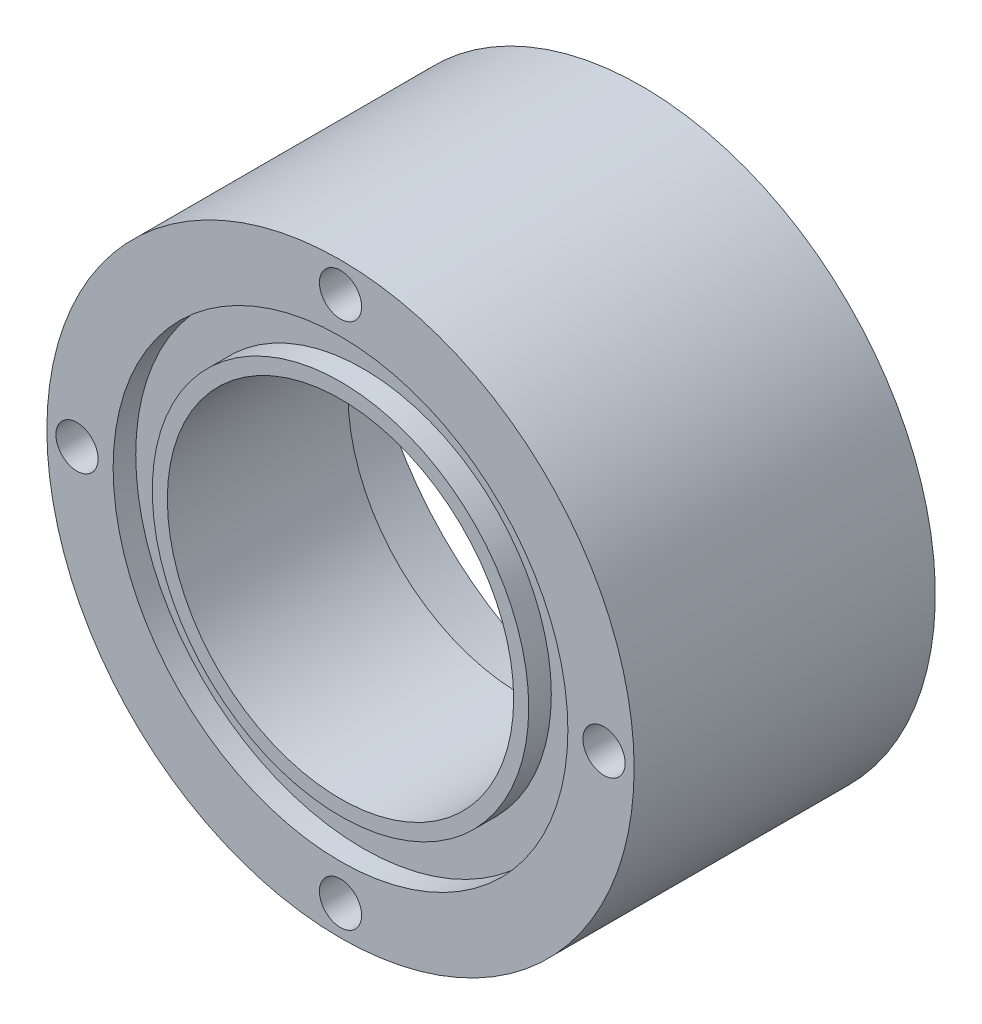
ISO-10303-21;
HEADER;
FILE_DESCRIPTION(('STEP AP214'),'2;1');
FILE_NAME('part.step','',(''),(''),'','','');
FILE_SCHEMA(('AUTOMOTIVE_DESIGN { 1 0 10303 214 1 1 1 1 }'));
ENDSEC;
DATA;
#1=APPLICATION_CONTEXT('core data for automotive mechanical design processes');
#2=APPLICATION_PROTOCOL_DEFINITION('international standard','automotive_design',2000,#1);
#3=PRODUCT_CONTEXT('',#1,'mechanical');
#4=PRODUCT('Part','Part','',(#3));
#5=PRODUCT_RELATED_PRODUCT_CATEGORY('part','',(#4));
#6=PRODUCT_DEFINITION_FORMATION('','',#4);
#7=PRODUCT_DEFINITION_CONTEXT('part definition',#1,'design');
#8=PRODUCT_DEFINITION('design','',#6,#7);
#9=PRODUCT_DEFINITION_SHAPE('','',#8);
#10=(LENGTH_UNIT() NAMED_UNIT(*) SI_UNIT(.MILLI.,.METRE.));
#11=(NAMED_UNIT(*) PLANE_ANGLE_UNIT() SI_UNIT($,.RADIAN.));
#12=(NAMED_UNIT(*) SI_UNIT($,.STERADIAN.) SOLID_ANGLE_UNIT());
#13=UNCERTAINTY_MEASURE_WITH_UNIT(LENGTH_MEASURE(1.E-05),#10,'distance_accuracy_value','');
#14=(GEOMETRIC_REPRESENTATION_CONTEXT(3) GLOBAL_UNCERTAINTY_ASSIGNED_CONTEXT((#13)) GLOBAL_UNIT_ASSIGNED_CONTEXT((#10,
#11,#12)) REPRESENTATION_CONTEXT('',''));
#15=CARTESIAN_POINT('',(0.,0.,0.));
#16=DIRECTION('',(0.,0.,1.));
#17=DIRECTION('',(1.,0.,0.));
#18=AXIS2_PLACEMENT_3D('',#15,#16,#17);
#19=CARTESIAN_POINT('',(0.,0.,0.));
#20=DIRECTION('',(0.,0.,1.));
#21=DIRECTION('',(1.,0.,0.));
#22=AXIS2_PLACEMENT_3D('',#19,#20,#21);
#23=PLANE('',#22);
#24=CARTESIAN_POINT('',(-17.,0.,0.));
#25=DIRECTION('',(0.,0.,-1.));
#26=DIRECTION('',(-1.,0.,0.));
#27=AXIS2_PLACEMENT_3D('',#24,#25,#26);
#28=CIRCLE('',#27,1.4);
#29=CARTESIAN_POINT('',(-18.4,0.,0.));
#30=VERTEX_POINT('',#29);
#31=EDGE_CURVE('E127',#30,#30,#28,.T.);
#32=ORIENTED_EDGE('',*,*,#31,.F.);
#33=EDGE_LOOP('',(#32));
#34=FACE_BOUND('',#33,.T.);
#35=CARTESIAN_POINT('',(0.,17.,0.));
#36=DIRECTION('',(0.,0.,-1.));
#37=DIRECTION('',(-1.,0.,0.));
#38=AXIS2_PLACEMENT_3D('',#35,#36,#37);
#39=CIRCLE('',#38,1.4);
#40=CARTESIAN_POINT('',(-1.4,17.,0.));
#41=VERTEX_POINT('',#40);
#42=EDGE_CURVE('E126',#41,#41,#39,.T.);
#43=ORIENTED_EDGE('',*,*,#42,.F.);
#44=EDGE_LOOP('',(#43));
#45=FACE_BOUND('',#44,.T.);
#46=CARTESIAN_POINT('',(17.,0.,0.));
#47=DIRECTION('',(0.,0.,-1.));
#48=DIRECTION('',(-1.,0.,0.));
#49=AXIS2_PLACEMENT_3D('',#46,#47,#48);
#50=CIRCLE('',#49,1.4);
#51=CARTESIAN_POINT('',(15.6,0.,0.));
#52=VERTEX_POINT('',#51);
#53=EDGE_CURVE('E276',#52,#52,#50,.T.);
#54=ORIENTED_EDGE('',*,*,#53,.F.);
#55=EDGE_LOOP('',(#54));
#56=FACE_BOUND('',#55,.T.);
#57=CARTESIAN_POINT('',(0.,-17.,0.));
#58=DIRECTION('',(0.,0.,-1.));
#59=DIRECTION('',(-1.,0.,0.));
#60=AXIS2_PLACEMENT_3D('',#57,#58,#59);
#61=CIRCLE('',#60,1.4);
#62=CARTESIAN_POINT('',(-1.4,-17.,0.));
#63=VERTEX_POINT('',#62);
#64=EDGE_CURVE('E270',#63,#63,#61,.T.);
#65=ORIENTED_EDGE('',*,*,#64,.F.);
#66=EDGE_LOOP('',(#65));
#67=FACE_BOUND('',#66,.T.);
#68=CARTESIAN_POINT('',(0.,0.,0.));
#69=DIRECTION('',(0.,0.,-1.));
#70=DIRECTION('',(-1.,0.,0.));
#71=AXIS2_PLACEMENT_3D('',#68,#69,#70);
#72=CIRCLE('',#71,15.1);
#73=CARTESIAN_POINT('',(-15.1,0.,0.));
#74=VERTEX_POINT('',#73);
#75=EDGE_CURVE('E257',#74,#74,#72,.T.);
#76=ORIENTED_EDGE('',*,*,#75,.F.);
#77=EDGE_LOOP('',(#76));
#78=FACE_BOUND('',#77,.T.);
#79=CARTESIAN_POINT('',(0.,0.,0.));
#80=DIRECTION('',(0.,0.,-1.));
#81=DIRECTION('',(-1.,0.,0.));
#82=AXIS2_PLACEMENT_3D('',#79,#80,#81);
#83=CIRCLE('',#82,18.5);
#84=CARTESIAN_POINT('',(-18.5,0.,0.));
#85=VERTEX_POINT('',#84);
#86=EDGE_CURVE('E366',#85,#85,#83,.T.);
#87=ORIENTED_EDGE('',*,*,#86,.T.);
#88=EDGE_LOOP('',(#87));
#89=FACE_BOUND('',#88,.T.);
#90=ADVANCED_FACE('F45',(#34,#45,#56,#67,#78,#89),#23,.F.);
#91=CARTESIAN_POINT('',(0.,0.,0.));
#92=DIRECTION('',(0.,0.,1.));
#93=DIRECTION('',(1.,0.,0.));
#94=AXIS2_PLACEMENT_3D('',#91,#92,#93);
#95=CIRCLE('',#94,11.5);
#96=CARTESIAN_POINT('',(11.5,0.,0.));
#97=VERTEX_POINT('',#96);
#98=EDGE_CURVE('E185',#97,#97,#95,.T.);
#99=ORIENTED_EDGE('',*,*,#98,.T.);
#100=EDGE_LOOP('',(#99));
#101=FACE_BOUND('',#100,.T.);
#102=CARTESIAN_POINT('',(0.,0.,0.));
#103=DIRECTION('',(0.,0.,-1.));
#104=DIRECTION('',(-1.,0.,0.));
#105=AXIS2_PLACEMENT_3D('',#102,#103,#104);
#106=CIRCLE('',#105,12.5);
#107=CARTESIAN_POINT('',(-12.5,0.,0.));
#108=VERTEX_POINT('',#107);
#109=EDGE_CURVE('E251',#108,#108,#106,.T.);
#110=ORIENTED_EDGE('',*,*,#109,.T.);
#111=EDGE_LOOP('',(#110));
#112=FACE_BOUND('',#111,.T.);
#113=ADVANCED_FACE('F225',(#101,#112),#23,.F.);
#114=CARTESIAN_POINT('',(0.,0.,12.));
#115=DIRECTION('',(0.,0.,1.));
#116=DIRECTION('',(1.,0.,0.));
#117=AXIS2_PLACEMENT_3D('',#114,#115,#116);
#118=PLANE('',#117);
#119=CARTESIAN_POINT('',(0.,0.,12.));
#120=DIRECTION('',(0.,0.,1.));
#121=DIRECTION('',(1.,0.,0.));
#122=AXIS2_PLACEMENT_3D('',#119,#120,#121);
#123=CIRCLE('',#122,11.5);
#124=CARTESIAN_POINT('',(11.5,0.,12.));
#125=VERTEX_POINT('',#124);
#126=EDGE_CURVE('E188',#125,#125,#123,.T.);
#127=ORIENTED_EDGE('',*,*,#126,.F.);
#128=EDGE_LOOP('',(#127));
#129=FACE_BOUND('',#128,.T.);
#130=CARTESIAN_POINT('',(0.,0.,12.));
#131=DIRECTION('',(0.,0.,1.));
#132=DIRECTION('',(1.,0.,0.));
#133=AXIS2_PLACEMENT_3D('',#130,#131,#132);
#134=CIRCLE('',#133,12.5);
#135=CARTESIAN_POINT('',(12.5,0.,12.));
#136=VERTEX_POINT('',#135);
#137=EDGE_CURVE('E153',#136,#136,#134,.T.);
#138=ORIENTED_EDGE('',*,*,#137,.T.);
#139=EDGE_LOOP('',(#138));
#140=FACE_BOUND('',#139,.T.);
#141=ADVANCED_FACE('F230',(#129,#140),#118,.T.);
#142=CARTESIAN_POINT('',(0.,0.,12.));
#143=DIRECTION('',(0.,0.,1.));
#144=DIRECTION('',(1.,0.,0.));
#145=AXIS2_PLACEMENT_3D('',#142,#143,#144);
#146=CIRCLE('',#145,15.1);
#147=CARTESIAN_POINT('',(15.1,0.,12.));
#148=VERTEX_POINT('',#147);
#149=EDGE_CURVE('E157',#148,#148,#146,.T.);
#150=ORIENTED_EDGE('',*,*,#149,.F.);
#151=EDGE_LOOP('',(#150));
#152=FACE_BOUND('',#151,.T.);
#153=CARTESIAN_POINT('',(-17.5,0.,12.));
#154=DIRECTION('',(0.,0.,1.));
#155=DIRECTION('',(0.,1.,0.));
#156=AXIS2_PLACEMENT_3D('',#153,#154,#155);
#157=CIRCLE('',#156,1.4);
#158=CARTESIAN_POINT('',(-17.5,1.39999999999994,12.));
#159=VERTEX_POINT('',#158);
#160=EDGE_CURVE('E168',#159,#159,#157,.T.);
#161=ORIENTED_EDGE('',*,*,#160,.F.);
#162=EDGE_LOOP('',(#161));
#163=FACE_BOUND('',#162,.T.);
#164=CARTESIAN_POINT('',(0.,-17.5,12.));
#165=DIRECTION('',(0.,0.,1.));
#166=DIRECTION('',(-1.,0.,0.));
#167=AXIS2_PLACEMENT_3D('',#164,#165,#166);
#168=CIRCLE('',#167,1.4);
#169=CARTESIAN_POINT('',(-1.4,-17.5,12.));
#170=VERTEX_POINT('',#169);
#171=EDGE_CURVE('E174',#170,#170,#168,.T.);
#172=ORIENTED_EDGE('',*,*,#171,.F.);
#173=EDGE_LOOP('',(#172));
#174=FACE_BOUND('',#173,.T.);
#175=CARTESIAN_POINT('',(17.5,1.83302770289265E-13,12.));
#176=DIRECTION('',(0.,0.,1.));
#177=DIRECTION('',(0.,-1.,0.));
#178=AXIS2_PLACEMENT_3D('',#175,#176,#177);
#179=CIRCLE('',#178,1.4);
#180=CARTESIAN_POINT('',(17.5,-1.39999999999982,12.));
#181=VERTEX_POINT('',#180);
#182=EDGE_CURVE('E163',#181,#181,#179,.T.);
#183=ORIENTED_EDGE('',*,*,#182,.F.);
#184=EDGE_LOOP('',(#183));
#185=FACE_BOUND('',#184,.T.);
#186=CARTESIAN_POINT('',(0.,17.5,12.));
#187=DIRECTION('',(0.,0.,1.));
#188=DIRECTION('',(1.,0.,0.));
#189=AXIS2_PLACEMENT_3D('',#186,#187,#188);
#190=CIRCLE('',#189,1.4);
#191=CARTESIAN_POINT('',(1.4,17.5,12.));
#192=VERTEX_POINT('',#191);
#193=EDGE_CURVE('E167',#192,#192,#190,.T.);
#194=ORIENTED_EDGE('',*,*,#193,.F.);
#195=EDGE_LOOP('',(#194));
#196=FACE_BOUND('',#195,.T.);
#197=CARTESIAN_POINT('',(0.,0.,12.));
#198=DIRECTION('',(0.,0.,1.));
#199=DIRECTION('',(1.,0.,0.));
#200=AXIS2_PLACEMENT_3D('',#197,#198,#199);
#201=CIRCLE('',#200,19.5);
#202=CARTESIAN_POINT('',(19.5,0.,12.));
#203=VERTEX_POINT('',#202);
#204=EDGE_CURVE('E191',#203,#203,#201,.T.);
#205=ORIENTED_EDGE('',*,*,#204,.T.);
#206=EDGE_LOOP('',(#205));
#207=FACE_BOUND('',#206,.T.);
#208=ADVANCED_FACE('F235',(#152,#163,#174,#185,#196,#207),#118,.T.);
#209=CARTESIAN_POINT('',(0.,0.,12.));
#210=DIRECTION('',(0.,0.,-1.));
#211=DIRECTION('',(-1.,0.,0.));
#212=AXIS2_PLACEMENT_3D('',#209,#210,#211);
#213=CYLINDRICAL_SURFACE('',#212,19.5);
#214=ORIENTED_EDGE('',*,*,#204,.F.);
#215=EDGE_LOOP('',(#214));
#216=FACE_BOUND('',#215,.T.);
#217=CARTESIAN_POINT('',(0.,0.,-8.));
#218=DIRECTION('',(0.,0.,-1.));
#219=DIRECTION('',(-1.,0.,0.));
#220=AXIS2_PLACEMENT_3D('',#217,#218,#219);
#221=CIRCLE('',#220,19.5);
#222=CARTESIAN_POINT('',(-19.5,0.,-8.));
#223=VERTEX_POINT('',#222);
#224=EDGE_CURVE('E254',#223,#223,#221,.T.);
#225=ORIENTED_EDGE('',*,*,#224,.F.);
#226=EDGE_LOOP('',(#225));
#227=FACE_BOUND('',#226,.T.);
#228=ADVANCED_FACE('F47',(#216,#227),#213,.T.);
#229=CARTESIAN_POINT('',(0.,0.,12.));
#230=DIRECTION('',(0.,0.,-1.));
#231=DIRECTION('',(-1.,0.,0.));
#232=AXIS2_PLACEMENT_3D('',#229,#230,#231);
#233=CYLINDRICAL_SURFACE('',#232,11.5);
#234=ORIENTED_EDGE('',*,*,#126,.T.);
#235=EDGE_LOOP('',(#234));
#236=FACE_BOUND('',#235,.T.);
#237=ORIENTED_EDGE('',*,*,#98,.F.);
#238=EDGE_LOOP('',(#237));
#239=FACE_BOUND('',#238,.T.);
#240=ADVANCED_FACE('F222',(#236,#239),#233,.F.);
#241=CARTESIAN_POINT('',(0.,17.5,5.));
#242=DIRECTION('',(0.,0.,1.));
#243=DIRECTION('',(1.,0.,0.));
#244=AXIS2_PLACEMENT_3D('',#241,#242,#243);
#245=CYLINDRICAL_SURFACE('',#244,1.4);
#246=CARTESIAN_POINT('',(0.,17.5,5.));
#247=DIRECTION('',(0.,0.,1.));
#248=DIRECTION('',(1.,0.,0.));
#249=AXIS2_PLACEMENT_3D('',#246,#247,#248);
#250=CIRCLE('',#249,1.4);
#251=CARTESIAN_POINT('',(1.37749773139559,17.25,5.));
#252=VERTEX_POINT('',#251);
#253=CARTESIAN_POINT('',(-1.37749773139559,17.25,5.));
#254=VERTEX_POINT('',#253);
#255=EDGE_CURVE('E182',#252,#254,#250,.T.);
#256=ORIENTED_EDGE('',*,*,#255,.F.);
#257=DIRECTION('',(0.,0.,-1.));
#258=VECTOR('',#257,1.);
#259=CARTESIAN_POINT('',(1.37749773139559,17.25,3.5));
#260=LINE('',#259,#258);
#261=CARTESIAN_POINT('',(1.37749773139559,17.25,7.));
#262=VERTEX_POINT('',#261);
#263=EDGE_CURVE('E60',#252,#262,#260,.F.);
#264=ORIENTED_EDGE('',*,*,#263,.T.);
#265=CARTESIAN_POINT('',(0.,17.5,7.));
#266=DIRECTION('',(0.,0.,-1.));
#267=DIRECTION('',(-1.,0.,0.));
#268=AXIS2_PLACEMENT_3D('',#265,#266,#267);
#269=CIRCLE('',#268,1.4);
#270=CARTESIAN_POINT('',(-1.37749773139559,17.25,7.));
#271=VERTEX_POINT('',#270);
#272=EDGE_CURVE('E12',#271,#262,#269,.F.);
#273=ORIENTED_EDGE('',*,*,#272,.F.);
#274=DIRECTION('',(0.,0.,-1.));
#275=VECTOR('',#274,1.);
#276=CARTESIAN_POINT('',(-1.37749773139559,17.25,3.5));
#277=LINE('',#276,#275);
#278=EDGE_CURVE('E149',#271,#254,#277,.T.);
#279=ORIENTED_EDGE('',*,*,#278,.T.);
#280=EDGE_LOOP('',(#256,#264,#273,#279));
#281=FACE_BOUND('',#280,.T.);
#282=ORIENTED_EDGE('',*,*,#193,.T.);
#283=EDGE_LOOP('',(#282));
#284=FACE_BOUND('',#283,.T.);
#285=ADVANCED_FACE('F209',(#281,#284),#245,.F.);
#286=CARTESIAN_POINT('',(0.,0.,5.));
#287=DIRECTION('',(0.,0.,1.));
#288=DIRECTION('',(1.,0.,0.));
#289=AXIS2_PLACEMENT_3D('',#286,#287,#288);
#290=PLANE('',#289);
#291=CARTESIAN_POINT('',(0.,17.,5.));
#292=DIRECTION('',(0.,0.,1.));
#293=DIRECTION('',(1.,0.,0.));
#294=AXIS2_PLACEMENT_3D('',#291,#292,#293);
#295=CIRCLE('',#294,1.4);
#296=EDGE_CURVE('E53',#252,#254,#295,.T.);
#297=ORIENTED_EDGE('',*,*,#296,.F.);
#298=ORIENTED_EDGE('',*,*,#255,.T.);
#299=EDGE_LOOP('',(#297,#298));
#300=FACE_BOUND('',#299,.T.);
#301=ADVANCED_FACE('F211',(#300),#290,.T.);
#302=CARTESIAN_POINT('',(17.5,1.83302770289265E-13,5.));
#303=DIRECTION('',(0.,0.,1.));
#304=DIRECTION('',(1.,0.,0.));
#305=AXIS2_PLACEMENT_3D('',#302,#303,#304);
#306=CYLINDRICAL_SURFACE('',#305,1.4);
#307=CARTESIAN_POINT('',(17.5,1.83302770289265E-13,5.));
#308=DIRECTION('',(0.,0.,1.));
#309=DIRECTION('',(0.,-1.,0.));
#310=AXIS2_PLACEMENT_3D('',#307,#308,#309);
#311=CIRCLE('',#310,1.4);
#312=CARTESIAN_POINT('',(17.2500000000005,-1.3774977313955,5.));
#313=VERTEX_POINT('',#312);
#314=CARTESIAN_POINT('',(17.2499999999995,1.37749773139568,5.));
#315=VERTEX_POINT('',#314);
#316=EDGE_CURVE('E177',#313,#315,#311,.T.);
#317=ORIENTED_EDGE('',*,*,#316,.F.);
#318=DIRECTION('',(0.,0.,-1.));
#319=VECTOR('',#318,1.);
#320=CARTESIAN_POINT('',(17.2500000000005,-1.3774977313955,3.5));
#321=LINE('',#320,#319);
#322=CARTESIAN_POINT('',(17.2500000000005,-1.3774977313955,7.));
#323=VERTEX_POINT('',#322);
#324=EDGE_CURVE('E68',#313,#323,#321,.F.);
#325=ORIENTED_EDGE('',*,*,#324,.T.);
#326=CARTESIAN_POINT('',(17.5,1.83302770289265E-13,7.));
#327=DIRECTION('',(0.,0.,-1.));
#328=DIRECTION('',(-1.,0.,0.));
#329=AXIS2_PLACEMENT_3D('',#326,#327,#328);
#330=CIRCLE('',#329,1.4);
#331=CARTESIAN_POINT('',(17.2499999999995,1.37749773139568,7.));
#332=VERTEX_POINT('',#331);
#333=EDGE_CURVE('E202',#332,#323,#330,.F.);
#334=ORIENTED_EDGE('',*,*,#333,.F.);
#335=DIRECTION('',(0.,0.,-1.));
#336=VECTOR('',#335,1.);
#337=CARTESIAN_POINT('',(17.2499999999995,1.37749773139568,3.5));
#338=LINE('',#337,#336);
#339=EDGE_CURVE('E145',#332,#315,#338,.T.);
#340=ORIENTED_EDGE('',*,*,#339,.T.);
#341=EDGE_LOOP('',(#317,#325,#334,#340));
#342=FACE_BOUND('',#341,.T.);
#343=ORIENTED_EDGE('',*,*,#182,.T.);
#344=EDGE_LOOP('',(#343));
#345=FACE_BOUND('',#344,.T.);
#346=ADVANCED_FACE('F213',(#342,#345),#306,.F.);
#347=CARTESIAN_POINT('',(0.,0.,5.));
#348=DIRECTION('',(0.,0.,1.));
#349=DIRECTION('',(0.,-1.,0.));
#350=AXIS2_PLACEMENT_3D('',#347,#348,#349);
#351=PLANE('',#350);
#352=CARTESIAN_POINT('',(17.,0.,5.));
#353=DIRECTION('',(0.,0.,1.));
#354=DIRECTION('',(1.,0.,0.));
#355=AXIS2_PLACEMENT_3D('',#352,#353,#354);
#356=CIRCLE('',#355,1.4);
#357=EDGE_CURVE('E200',#313,#315,#356,.T.);
#358=ORIENTED_EDGE('',*,*,#357,.F.);
#359=ORIENTED_EDGE('',*,*,#316,.T.);
#360=EDGE_LOOP('',(#358,#359));
#361=FACE_BOUND('',#360,.T.);
#362=ADVANCED_FACE('F219',(#361),#351,.T.);
#363=CARTESIAN_POINT('',(0.,-17.5,5.));
#364=DIRECTION('',(0.,0.,1.));
#365=DIRECTION('',(1.,0.,0.));
#366=AXIS2_PLACEMENT_3D('',#363,#364,#365);
#367=CYLINDRICAL_SURFACE('',#366,1.4);
#368=CARTESIAN_POINT('',(0.,-17.5,5.));
#369=DIRECTION('',(0.,0.,1.));
#370=DIRECTION('',(-1.,0.,0.));
#371=AXIS2_PLACEMENT_3D('',#368,#369,#370);
#372=CIRCLE('',#371,1.4);
#373=CARTESIAN_POINT('',(-1.37749773139559,-17.25,5.));
#374=VERTEX_POINT('',#373);
#375=CARTESIAN_POINT('',(1.37749773139559,-17.25,5.));
#376=VERTEX_POINT('',#375);
#377=EDGE_CURVE('E171',#374,#376,#372,.T.);
#378=ORIENTED_EDGE('',*,*,#377,.F.);
#379=DIRECTION('',(0.,0.,-1.));
#380=VECTOR('',#379,1.);
#381=CARTESIAN_POINT('',(-1.37749773139559,-17.25,3.5));
#382=LINE('',#381,#380);
#383=CARTESIAN_POINT('',(-1.37749773139559,-17.25,7.));
#384=VERTEX_POINT('',#383);
#385=EDGE_CURVE('E137',#374,#384,#382,.F.);
#386=ORIENTED_EDGE('',*,*,#385,.T.);
#387=CARTESIAN_POINT('',(0.,-17.5,7.));
#388=DIRECTION('',(0.,0.,-1.));
#389=DIRECTION('',(-1.,0.,0.));
#390=AXIS2_PLACEMENT_3D('',#387,#388,#389);
#391=CIRCLE('',#390,1.4);
#392=CARTESIAN_POINT('',(1.37749773139559,-17.25,7.));
#393=VERTEX_POINT('',#392);
#394=EDGE_CURVE('E198',#393,#384,#391,.F.);
#395=ORIENTED_EDGE('',*,*,#394,.F.);
#396=DIRECTION('',(0.,0.,-1.));
#397=VECTOR('',#396,1.);
#398=CARTESIAN_POINT('',(1.37749773139559,-17.25,3.5));
#399=LINE('',#398,#397);
#400=EDGE_CURVE('E134',#393,#376,#399,.T.);
#401=ORIENTED_EDGE('',*,*,#400,.T.);
#402=EDGE_LOOP('',(#378,#386,#395,#401));
#403=FACE_BOUND('',#402,.T.);
#404=ORIENTED_EDGE('',*,*,#171,.T.);
#405=EDGE_LOOP('',(#404));
#406=FACE_BOUND('',#405,.T.);
#407=ADVANCED_FACE('F318',(#403,#406),#367,.F.);
#408=CARTESIAN_POINT('',(0.,0.,5.));
#409=DIRECTION('',(0.,0.,1.));
#410=DIRECTION('',(-1.,0.,0.));
#411=AXIS2_PLACEMENT_3D('',#408,#409,#410);
#412=PLANE('',#411);
#413=CARTESIAN_POINT('',(0.,-17.,5.));
#414=DIRECTION('',(0.,0.,1.));
#415=DIRECTION('',(1.,0.,0.));
#416=AXIS2_PLACEMENT_3D('',#413,#414,#415);
#417=CIRCLE('',#416,1.4);
#418=EDGE_CURVE('E118',#374,#376,#417,.T.);
#419=ORIENTED_EDGE('',*,*,#418,.F.);
#420=ORIENTED_EDGE('',*,*,#377,.T.);
#421=EDGE_LOOP('',(#419,#420));
#422=FACE_BOUND('',#421,.T.);
#423=ADVANCED_FACE('F315',(#422),#412,.T.);
#424=CARTESIAN_POINT('',(-17.5,0.,5.));
#425=DIRECTION('',(0.,0.,1.));
#426=DIRECTION('',(1.,0.,0.));
#427=AXIS2_PLACEMENT_3D('',#424,#425,#426);
#428=CYLINDRICAL_SURFACE('',#427,1.4);
#429=CARTESIAN_POINT('',(-17.5,0.,5.));
#430=DIRECTION('',(0.,0.,1.));
#431=DIRECTION('',(0.,1.,0.));
#432=AXIS2_PLACEMENT_3D('',#429,#430,#431);
#433=CIRCLE('',#432,1.4);
#434=CARTESIAN_POINT('',(-17.2500000000002,1.37749773139556,5.));
#435=VERTEX_POINT('',#434);
#436=CARTESIAN_POINT('',(-17.2499999999998,-1.37749773139562,5.));
#437=VERTEX_POINT('',#436);
#438=EDGE_CURVE('E133',#435,#437,#433,.T.);
#439=ORIENTED_EDGE('',*,*,#438,.F.);
#440=DIRECTION('',(0.,0.,-1.));
#441=VECTOR('',#440,1.);
#442=CARTESIAN_POINT('',(-17.2500000000002,1.37749773139556,3.5));
#443=LINE('',#442,#441);
#444=CARTESIAN_POINT('',(-17.2500000000002,1.37749773139556,7.));
#445=VERTEX_POINT('',#444);
#446=EDGE_CURVE('E123',#435,#445,#443,.F.);
#447=ORIENTED_EDGE('',*,*,#446,.T.);
#448=CARTESIAN_POINT('',(-17.5,0.,7.));
#449=DIRECTION('',(0.,0.,-1.));
#450=DIRECTION('',(-1.,0.,0.));
#451=AXIS2_PLACEMENT_3D('',#448,#449,#450);
#452=CIRCLE('',#451,1.4);
#453=CARTESIAN_POINT('',(-17.2499999999998,-1.37749773139562,7.));
#454=VERTEX_POINT('',#453);
#455=EDGE_CURVE('E111',#454,#445,#452,.F.);
#456=ORIENTED_EDGE('',*,*,#455,.F.);
#457=DIRECTION('',(0.,0.,-1.));
#458=VECTOR('',#457,1.);
#459=CARTESIAN_POINT('',(-17.2499999999998,-1.37749773139562,3.5));
#460=LINE('',#459,#458);
#461=EDGE_CURVE('E125',#454,#437,#460,.T.);
#462=ORIENTED_EDGE('',*,*,#461,.T.);
#463=EDGE_LOOP('',(#439,#447,#456,#462));
#464=FACE_BOUND('',#463,.T.);
#465=ORIENTED_EDGE('',*,*,#160,.T.);
#466=EDGE_LOOP('',(#465));
#467=FACE_BOUND('',#466,.T.);
#468=ADVANCED_FACE('F130',(#464,#467),#428,.F.);
#469=CARTESIAN_POINT('',(0.,0.,5.));
#470=DIRECTION('',(0.,0.,1.));
#471=DIRECTION('',(0.,1.,0.));
#472=AXIS2_PLACEMENT_3D('',#469,#470,#471);
#473=PLANE('',#472);
#474=CARTESIAN_POINT('',(-17.,0.,5.));
#475=DIRECTION('',(0.,0.,1.));
#476=DIRECTION('',(1.,0.,0.));
#477=AXIS2_PLACEMENT_3D('',#474,#475,#476);
#478=CIRCLE('',#477,1.4);
#479=EDGE_CURVE('E119',#435,#437,#478,.T.);
#480=ORIENTED_EDGE('',*,*,#479,.F.);
#481=ORIENTED_EDGE('',*,*,#438,.T.);
#482=EDGE_LOOP('',(#480,#481));
#483=FACE_BOUND('',#482,.T.);
#484=ADVANCED_FACE('F308',(#483),#473,.T.);
#485=CARTESIAN_POINT('',(0.,0.,10.5));
#486=DIRECTION('',(0.,0.,1.));
#487=DIRECTION('',(1.,0.,0.));
#488=AXIS2_PLACEMENT_3D('',#485,#486,#487);
#489=CYLINDRICAL_SURFACE('',#488,15.1);
#490=CARTESIAN_POINT('',(0.,0.,10.5));
#491=DIRECTION('',(0.,0.,1.));
#492=DIRECTION('',(1.,0.,0.));
#493=AXIS2_PLACEMENT_3D('',#490,#491,#492);
#494=CIRCLE('',#493,15.1);
#495=CARTESIAN_POINT('',(15.1,0.,10.5));
#496=VERTEX_POINT('',#495);
#497=EDGE_CURVE('E160',#496,#496,#494,.T.);
#498=ORIENTED_EDGE('',*,*,#497,.F.);
#499=EDGE_LOOP('',(#498));
#500=FACE_BOUND('',#499,.T.);
#501=ORIENTED_EDGE('',*,*,#149,.T.);
#502=EDGE_LOOP('',(#501));
#503=FACE_BOUND('',#502,.T.);
#504=ADVANCED_FACE('F304',(#500,#503),#489,.F.);
#505=CARTESIAN_POINT('',(0.,0.,10.5));
#506=DIRECTION('',(0.,0.,1.));
#507=DIRECTION('',(1.,0.,0.));
#508=AXIS2_PLACEMENT_3D('',#505,#506,#507);
#509=PLANE('',#508);
#510=CARTESIAN_POINT('',(0.,0.,10.5));
#511=DIRECTION('',(0.,0.,1.));
#512=DIRECTION('',(1.,0.,0.));
#513=AXIS2_PLACEMENT_3D('',#510,#511,#512);
#514=CIRCLE('',#513,12.5);
#515=CARTESIAN_POINT('',(12.5,0.,10.5));
#516=VERTEX_POINT('',#515);
#517=EDGE_CURVE('E154',#516,#516,#514,.T.);
#518=ORIENTED_EDGE('',*,*,#517,.F.);
#519=EDGE_LOOP('',(#518));
#520=FACE_BOUND('',#519,.T.);
#521=ORIENTED_EDGE('',*,*,#497,.T.);
#522=EDGE_LOOP('',(#521));
#523=FACE_BOUND('',#522,.T.);
#524=ADVANCED_FACE('F300',(#520,#523),#509,.T.);
#525=CARTESIAN_POINT('',(0.,0.,10.5));
#526=DIRECTION('',(0.,0.,1.));
#527=DIRECTION('',(1.,0.,0.));
#528=AXIS2_PLACEMENT_3D('',#525,#526,#527);
#529=CYLINDRICAL_SURFACE('',#528,12.5);
#530=ORIENTED_EDGE('',*,*,#517,.T.);
#531=EDGE_LOOP('',(#530));
#532=FACE_BOUND('',#531,.T.);
#533=ORIENTED_EDGE('',*,*,#137,.F.);
#534=EDGE_LOOP('',(#533));
#535=FACE_BOUND('',#534,.T.);
#536=ADVANCED_FACE('F294',(#532,#535),#529,.T.);
#537=CARTESIAN_POINT('',(0.,0.,7.));
#538=DIRECTION('',(0.,0.,-1.));
#539=DIRECTION('',(-1.,0.,0.));
#540=AXIS2_PLACEMENT_3D('',#537,#538,#539);
#541=PLANE('',#540);
#542=ORIENTED_EDGE('',*,*,#455,.T.);
#543=CARTESIAN_POINT('',(-17.,0.,7.));
#544=DIRECTION('',(0.,0.,-1.));
#545=DIRECTION('',(-1.,0.,0.));
#546=AXIS2_PLACEMENT_3D('',#543,#544,#545);
#547=CIRCLE('',#546,1.4);
#548=EDGE_CURVE('E114',#445,#454,#547,.T.);
#549=ORIENTED_EDGE('',*,*,#548,.T.);
#550=EDGE_LOOP('',(#542,#549));
#551=FACE_BOUND('',#550,.T.);
#552=ADVANCED_FACE('F113',(#551),#541,.T.);
#553=CARTESIAN_POINT('',(-17.,0.,7.));
#554=DIRECTION('',(0.,0.,-1.));
#555=DIRECTION('',(-1.,0.,0.));
#556=AXIS2_PLACEMENT_3D('',#553,#554,#555);
#557=CYLINDRICAL_SURFACE('',#556,1.4);
#558=ORIENTED_EDGE('',*,*,#31,.T.);
#559=EDGE_LOOP('',(#558));
#560=FACE_BOUND('',#559,.T.);
#561=ORIENTED_EDGE('',*,*,#479,.T.);
#562=ORIENTED_EDGE('',*,*,#461,.F.);
#563=ORIENTED_EDGE('',*,*,#548,.F.);
#564=ORIENTED_EDGE('',*,*,#446,.F.);
#565=EDGE_LOOP('',(#561,#562,#563,#564));
#566=FACE_BOUND('',#565,.T.);
#567=ADVANCED_FACE('F122',(#560,#566),#557,.F.);
#568=CARTESIAN_POINT('',(0.,0.,7.));
#569=DIRECTION('',(0.,0.,-1.));
#570=DIRECTION('',(-1.,0.,0.));
#571=AXIS2_PLACEMENT_3D('',#568,#569,#570);
#572=PLANE('',#571);
#573=ORIENTED_EDGE('',*,*,#394,.T.);
#574=CARTESIAN_POINT('',(0.,-17.,7.));
#575=DIRECTION('',(0.,0.,-1.));
#576=DIRECTION('',(-1.,0.,0.));
#577=AXIS2_PLACEMENT_3D('',#574,#575,#576);
#578=CIRCLE('',#577,1.4);
#579=EDGE_CURVE('E139',#384,#393,#578,.T.);
#580=ORIENTED_EDGE('',*,*,#579,.T.);
#581=EDGE_LOOP('',(#573,#580));
#582=FACE_BOUND('',#581,.T.);
#583=ADVANCED_FACE('F285',(#582),#572,.T.);
#584=CARTESIAN_POINT('',(0.,-17.,7.));
#585=DIRECTION('',(0.,0.,-1.));
#586=DIRECTION('',(-1.,0.,0.));
#587=AXIS2_PLACEMENT_3D('',#584,#585,#586);
#588=CYLINDRICAL_SURFACE('',#587,1.4);
#589=ORIENTED_EDGE('',*,*,#64,.T.);
#590=EDGE_LOOP('',(#589));
#591=FACE_BOUND('',#590,.T.);
#592=ORIENTED_EDGE('',*,*,#418,.T.);
#593=ORIENTED_EDGE('',*,*,#400,.F.);
#594=ORIENTED_EDGE('',*,*,#579,.F.);
#595=ORIENTED_EDGE('',*,*,#385,.F.);
#596=EDGE_LOOP('',(#592,#593,#594,#595));
#597=FACE_BOUND('',#596,.T.);
#598=ADVANCED_FACE('F291',(#591,#597),#588,.F.);
#599=CARTESIAN_POINT('',(0.,0.,7.));
#600=DIRECTION('',(0.,0.,-1.));
#601=DIRECTION('',(-1.,0.,0.));
#602=AXIS2_PLACEMENT_3D('',#599,#600,#601);
#603=PLANE('',#602);
#604=ORIENTED_EDGE('',*,*,#333,.T.);
#605=CARTESIAN_POINT('',(17.,0.,7.));
#606=DIRECTION('',(0.,0.,-1.));
#607=DIRECTION('',(-1.,0.,0.));
#608=AXIS2_PLACEMENT_3D('',#605,#606,#607);
#609=CIRCLE('',#608,1.4);
#610=EDGE_CURVE('E273',#323,#332,#609,.T.);
#611=ORIENTED_EDGE('',*,*,#610,.T.);
#612=EDGE_LOOP('',(#604,#611));
#613=FACE_BOUND('',#612,.T.);
#614=ADVANCED_FACE('F332',(#613),#603,.T.);
#615=CARTESIAN_POINT('',(17.,0.,7.));
#616=DIRECTION('',(0.,0.,-1.));
#617=DIRECTION('',(-1.,0.,0.));
#618=AXIS2_PLACEMENT_3D('',#615,#616,#617);
#619=CYLINDRICAL_SURFACE('',#618,1.4);
#620=ORIENTED_EDGE('',*,*,#53,.T.);
#621=EDGE_LOOP('',(#620));
#622=FACE_BOUND('',#621,.T.);
#623=ORIENTED_EDGE('',*,*,#357,.T.);
#624=ORIENTED_EDGE('',*,*,#339,.F.);
#625=ORIENTED_EDGE('',*,*,#610,.F.);
#626=ORIENTED_EDGE('',*,*,#324,.F.);
#627=EDGE_LOOP('',(#623,#624,#625,#626));
#628=FACE_BOUND('',#627,.T.);
#629=ADVANCED_FACE('F330',(#622,#628),#619,.F.);
#630=CARTESIAN_POINT('',(0.,0.,7.));
#631=DIRECTION('',(0.,0.,-1.));
#632=DIRECTION('',(-1.,0.,0.));
#633=AXIS2_PLACEMENT_3D('',#630,#631,#632);
#634=PLANE('',#633);
#635=ORIENTED_EDGE('',*,*,#272,.T.);
#636=CARTESIAN_POINT('',(0.,17.,7.));
#637=DIRECTION('',(0.,0.,-1.));
#638=DIRECTION('',(-1.,0.,0.));
#639=AXIS2_PLACEMENT_3D('',#636,#637,#638);
#640=CIRCLE('',#639,1.4);
#641=EDGE_CURVE('E279',#262,#271,#640,.T.);
#642=ORIENTED_EDGE('',*,*,#641,.T.);
#643=EDGE_LOOP('',(#635,#642));
#644=FACE_BOUND('',#643,.T.);
#645=ADVANCED_FACE('F339',(#644),#634,.T.);
#646=CARTESIAN_POINT('',(0.,17.,7.));
#647=DIRECTION('',(0.,0.,-1.));
#648=DIRECTION('',(-1.,0.,0.));
#649=AXIS2_PLACEMENT_3D('',#646,#647,#648);
#650=CYLINDRICAL_SURFACE('',#649,1.4);
#651=ORIENTED_EDGE('',*,*,#42,.T.);
#652=EDGE_LOOP('',(#651));
#653=FACE_BOUND('',#652,.T.);
#654=ORIENTED_EDGE('',*,*,#296,.T.);
#655=ORIENTED_EDGE('',*,*,#278,.F.);
#656=ORIENTED_EDGE('',*,*,#641,.F.);
#657=ORIENTED_EDGE('',*,*,#263,.F.);
#658=EDGE_LOOP('',(#654,#655,#656,#657));
#659=FACE_BOUND('',#658,.T.);
#660=ADVANCED_FACE('F203',(#653,#659),#650,.F.);
#661=CARTESIAN_POINT('',(0.,0.,1.5));
#662=DIRECTION('',(0.,0.,-1.));
#663=DIRECTION('',(-1.,0.,0.));
#664=AXIS2_PLACEMENT_3D('',#661,#662,#663);
#665=CYLINDRICAL_SURFACE('',#664,15.1);
#666=CARTESIAN_POINT('',(0.,0.,1.5));
#667=DIRECTION('',(0.,0.,-1.));
#668=DIRECTION('',(-1.,0.,0.));
#669=AXIS2_PLACEMENT_3D('',#666,#667,#668);
#670=CIRCLE('',#669,15.1);
#671=CARTESIAN_POINT('',(-15.1,0.,1.5));
#672=VERTEX_POINT('',#671);
#673=EDGE_CURVE('E263',#672,#672,#670,.T.);
#674=ORIENTED_EDGE('',*,*,#673,.F.);
#675=EDGE_LOOP('',(#674));
#676=FACE_BOUND('',#675,.T.);
#677=ORIENTED_EDGE('',*,*,#75,.T.);
#678=EDGE_LOOP('',(#677));
#679=FACE_BOUND('',#678,.T.);
#680=ADVANCED_FACE('F348',(#676,#679),#665,.F.);
#681=CARTESIAN_POINT('',(0.,0.,1.5));
#682=DIRECTION('',(0.,0.,-1.));
#683=DIRECTION('',(-1.,0.,0.));
#684=AXIS2_PLACEMENT_3D('',#681,#682,#683);
#685=PLANE('',#684);
#686=CARTESIAN_POINT('',(0.,0.,1.5));
#687=DIRECTION('',(0.,0.,-1.));
#688=DIRECTION('',(-1.,0.,0.));
#689=AXIS2_PLACEMENT_3D('',#686,#687,#688);
#690=CIRCLE('',#689,12.5);
#691=CARTESIAN_POINT('',(-12.5,0.,1.5));
#692=VERTEX_POINT('',#691);
#693=EDGE_CURVE('E253',#692,#692,#690,.T.);
#694=ORIENTED_EDGE('',*,*,#693,.F.);
#695=EDGE_LOOP('',(#694));
#696=FACE_BOUND('',#695,.T.);
#697=ORIENTED_EDGE('',*,*,#673,.T.);
#698=EDGE_LOOP('',(#697));
#699=FACE_BOUND('',#698,.T.);
#700=ADVANCED_FACE('F353',(#696,#699),#685,.T.);
#701=CARTESIAN_POINT('',(0.,0.,1.5));
#702=DIRECTION('',(0.,0.,-1.));
#703=DIRECTION('',(-1.,0.,0.));
#704=AXIS2_PLACEMENT_3D('',#701,#702,#703);
#705=CYLINDRICAL_SURFACE('',#704,12.5);
#706=ORIENTED_EDGE('',*,*,#693,.T.);
#707=EDGE_LOOP('',(#706));
#708=FACE_BOUND('',#707,.T.);
#709=ORIENTED_EDGE('',*,*,#109,.F.);
#710=EDGE_LOOP('',(#709));
#711=FACE_BOUND('',#710,.T.);
#712=ADVANCED_FACE('F377',(#708,#711),#705,.T.);
#713=CARTESIAN_POINT('',(0.,0.,-8.));
#714=DIRECTION('',(0.,0.,-1.));
#715=DIRECTION('',(-1.,0.,0.));
#716=AXIS2_PLACEMENT_3D('',#713,#714,#715);
#717=PLANE('',#716);
#718=ORIENTED_EDGE('',*,*,#224,.T.);
#719=EDGE_LOOP('',(#718));
#720=FACE_BOUND('',#719,.T.);
#721=CARTESIAN_POINT('',(0.,0.,-8.));
#722=DIRECTION('',(0.,0.,-1.));
#723=DIRECTION('',(-1.,0.,0.));
#724=AXIS2_PLACEMENT_3D('',#721,#722,#723);
#725=CIRCLE('',#724,18.5);
#726=CARTESIAN_POINT('',(-18.5,0.,-8.));
#727=VERTEX_POINT('',#726);
#728=EDGE_CURVE('E260',#727,#727,#725,.T.);
#729=ORIENTED_EDGE('',*,*,#728,.F.);
#730=EDGE_LOOP('',(#729));
#731=FACE_BOUND('',#730,.T.);
#732=ADVANCED_FACE('F375',(#720,#731),#717,.T.);
#733=CARTESIAN_POINT('',(0.,0.,-8.));
#734=DIRECTION('',(0.,0.,1.));
#735=DIRECTION('',(1.,0.,0.));
#736=AXIS2_PLACEMENT_3D('',#733,#734,#735);
#737=CYLINDRICAL_SURFACE('',#736,18.5);
#738=ORIENTED_EDGE('',*,*,#728,.T.);
#739=EDGE_LOOP('',(#738));
#740=FACE_BOUND('',#739,.T.);
#741=ORIENTED_EDGE('',*,*,#86,.F.);
#742=EDGE_LOOP('',(#741));
#743=FACE_BOUND('',#742,.T.);
#744=ADVANCED_FACE('F373',(#740,#743),#737,.F.);
#745=CLOSED_SHELL('',(#90,#113,#141,#208,#228,#240,#285,#301,#346,#362,#407,#423,#468,#484,#504,
#524,#536,#552,#567,#583,#598,#614,#629,#645,#660,#680,#700,#712,#732,#744));
#746=MANIFOLD_SOLID_BREP('B2',#745);
#747=ADVANCED_BREP_SHAPE_REPRESENTATION('',(#18,#746),#14);
#748=SHAPE_DEFINITION_REPRESENTATION(#9,#747);
ENDSEC;
END-ISO-10303-21;
